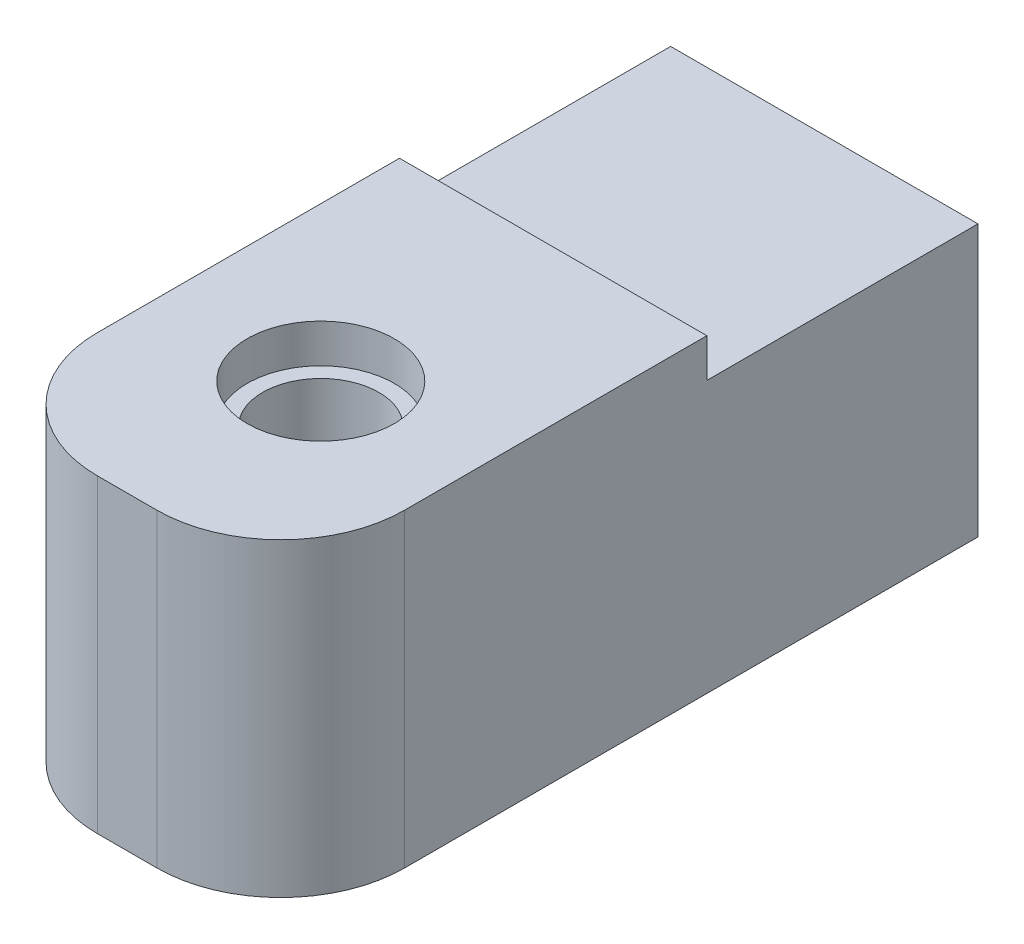
ISO-10303-21;
HEADER;
FILE_DESCRIPTION(('STEP AP214'),'2;1');
FILE_NAME('part.step','',(''),(''),'','','');
FILE_SCHEMA(('AUTOMOTIVE_DESIGN { 1 0 10303 214 1 1 1 1 }'));
ENDSEC;
DATA;
#1=APPLICATION_CONTEXT('core data for automotive mechanical design processes');
#2=APPLICATION_PROTOCOL_DEFINITION('international standard','automotive_design',2000,#1);
#3=PRODUCT_CONTEXT('',#1,'mechanical');
#4=PRODUCT('Part','Part','',(#3));
#5=PRODUCT_RELATED_PRODUCT_CATEGORY('part','',(#4));
#6=PRODUCT_DEFINITION_FORMATION('','',#4);
#7=PRODUCT_DEFINITION_CONTEXT('part definition',#1,'design');
#8=PRODUCT_DEFINITION('design','',#6,#7);
#9=PRODUCT_DEFINITION_SHAPE('','',#8);
#10=(LENGTH_UNIT() NAMED_UNIT(*) SI_UNIT(.MILLI.,.METRE.));
#11=(NAMED_UNIT(*) PLANE_ANGLE_UNIT() SI_UNIT($,.RADIAN.));
#12=(NAMED_UNIT(*) SI_UNIT($,.STERADIAN.) SOLID_ANGLE_UNIT());
#13=UNCERTAINTY_MEASURE_WITH_UNIT(LENGTH_MEASURE(1.E-05),#10,'distance_accuracy_value','');
#14=(GEOMETRIC_REPRESENTATION_CONTEXT(3) GLOBAL_UNCERTAINTY_ASSIGNED_CONTEXT((#13)) GLOBAL_UNIT_ASSIGNED_CONTEXT((#10,
#11,#12)) REPRESENTATION_CONTEXT('',''));
#15=CARTESIAN_POINT('',(0.,0.,0.));
#16=DIRECTION('',(0.,0.,1.));
#17=DIRECTION('',(1.,0.,0.));
#18=AXIS2_PLACEMENT_3D('',#15,#16,#17);
#19=CARTESIAN_POINT('',(-4.26803278688524,9.21270491803279,57.15));
#20=DIRECTION('',(-1.,0.,0.));
#21=DIRECTION('',(0.,0.,1.));
#22=AXIS2_PLACEMENT_3D('',#19,#20,#21);
#23=PLANE('',#22);
#24=DIRECTION('',(0.,0.,-1.));
#25=VECTOR('',#24,1.);
#26=CARTESIAN_POINT('',(-4.26803278688524,9.21270491803279,57.15));
#27=LINE('',#26,#25);
#28=CARTESIAN_POINT('',(-4.26803278688524,9.21270491803279,46.99));
#29=VERTEX_POINT('',#28);
#30=CARTESIAN_POINT('',(-4.26803278688524,9.21270491803279,22.225));
#31=VERTEX_POINT('',#30);
#32=EDGE_CURVE('E97',#29,#31,#27,.T.);
#33=ORIENTED_EDGE('',*,*,#32,.F.);
#34=DIRECTION('',(0.,1.,0.));
#35=VECTOR('',#34,1.);
#36=CARTESIAN_POINT('',(-4.26803278688524,-16.1872950819672,46.99));
#37=LINE('',#36,#35);
#38=CARTESIAN_POINT('',(-4.26803278688524,-16.1872950819672,46.99));
#39=VERTEX_POINT('',#38);
#40=EDGE_CURVE('E165',#29,#39,#37,.F.);
#41=ORIENTED_EDGE('',*,*,#40,.T.);
#42=DIRECTION('',(0.,0.,-1.));
#43=VECTOR('',#42,1.);
#44=CARTESIAN_POINT('',(-4.26803278688524,-16.1872950819672,57.15));
#45=LINE('',#44,#43);
#46=CARTESIAN_POINT('',(-4.26803278688524,-16.1872950819672,0.));
#47=VERTEX_POINT('',#46);
#48=EDGE_CURVE('E147',#39,#47,#45,.T.);
#49=ORIENTED_EDGE('',*,*,#48,.T.);
#50=DIRECTION('',(0.,1.,0.));
#51=VECTOR('',#50,1.);
#52=CARTESIAN_POINT('',(-4.26803278688524,9.21270491803279,0.));
#53=LINE('',#52,#51);
#54=CARTESIAN_POINT('',(-4.26803278688524,6.03770491803279,0.));
#55=VERTEX_POINT('',#54);
#56=EDGE_CURVE('E138',#47,#55,#53,.T.);
#57=ORIENTED_EDGE('',*,*,#56,.T.);
#58=DIRECTION('',(0.,0.,-1.));
#59=VECTOR('',#58,1.);
#60=CARTESIAN_POINT('',(-4.26803278688524,6.03770491803279,0.));
#61=LINE('',#60,#59);
#62=CARTESIAN_POINT('',(-4.26803278688524,6.03770491803279,22.225));
#63=VERTEX_POINT('',#62);
#64=EDGE_CURVE('E119',#63,#55,#61,.T.);
#65=ORIENTED_EDGE('',*,*,#64,.F.);
#66=DIRECTION('',(0.,-1.,0.));
#67=VECTOR('',#66,1.);
#68=CARTESIAN_POINT('',(-4.26803278688524,9.21270491803279,22.225));
#69=LINE('',#68,#67);
#70=EDGE_CURVE('E114',#31,#63,#69,.T.);
#71=ORIENTED_EDGE('',*,*,#70,.F.);
#72=EDGE_LOOP('',(#33,#41,#49,#57,#65,#71));
#73=FACE_BOUND('',#72,.T.);
#74=ADVANCED_FACE('F34',(#73),#23,.F.);
#75=CARTESIAN_POINT('',(-29.4598360655737,9.21270491803279,57.15));
#76=DIRECTION('',(0.,-1.,0.));
#77=DIRECTION('',(0.,0.,-1.));
#78=AXIS2_PLACEMENT_3D('',#75,#76,#77);
#79=PLANE('',#78);
#80=CARTESIAN_POINT('',(-16.8639344262295,9.21270491803279,41.275));
#81=DIRECTION('',(0.,1.,0.));
#82=DIRECTION('',(0.,0.,1.));
#83=AXIS2_PLACEMENT_3D('',#80,#81,#82);
#84=CIRCLE('',#83,6.0325);
#85=CARTESIAN_POINT('',(-16.8639344262295,9.21270491803279,47.3075));
#86=VERTEX_POINT('',#85);
#87=EDGE_CURVE('E126',#86,#86,#84,.T.);
#88=ORIENTED_EDGE('',*,*,#87,.F.);
#89=EDGE_LOOP('',(#88));
#90=FACE_BOUND('',#89,.T.);
#91=DIRECTION('',(0.,0.,-1.));
#92=VECTOR('',#91,1.);
#93=CARTESIAN_POINT('',(-29.4598360655737,9.21270491803279,57.15));
#94=LINE('',#93,#92);
#95=CARTESIAN_POINT('',(-29.4598360655737,9.21270491803279,46.99));
#96=VERTEX_POINT('',#95);
#97=CARTESIAN_POINT('',(-29.4598360655737,9.21270491803279,22.225));
#98=VERTEX_POINT('',#97);
#99=EDGE_CURVE('E107',#96,#98,#94,.T.);
#100=ORIENTED_EDGE('',*,*,#99,.F.);
#101=CARTESIAN_POINT('',(-19.2998360655737,9.21270491803279,46.99));
#102=DIRECTION('',(0.,-1.,0.));
#103=DIRECTION('',(0.,0.,-1.));
#104=AXIS2_PLACEMENT_3D('',#101,#102,#103);
#105=CIRCLE('',#104,10.16);
#106=CARTESIAN_POINT('',(-19.2998360655737,9.21270491803279,57.15));
#107=VERTEX_POINT('',#106);
#108=EDGE_CURVE('E11',#96,#107,#105,.F.);
#109=ORIENTED_EDGE('',*,*,#108,.T.);
#110=DIRECTION('',(-1.,0.,0.));
#111=VECTOR('',#110,1.);
#112=CARTESIAN_POINT('',(-29.4598360655737,9.21270491803279,57.15));
#113=LINE('',#112,#111);
#114=CARTESIAN_POINT('',(-14.4280327868852,9.21270491803279,57.15));
#115=VERTEX_POINT('',#114);
#116=EDGE_CURVE('E141',#115,#107,#113,.T.);
#117=ORIENTED_EDGE('',*,*,#116,.F.);
#118=CARTESIAN_POINT('',(-14.4280327868852,9.21270491803279,46.99));
#119=DIRECTION('',(0.,-1.,0.));
#120=DIRECTION('',(0.,0.,-1.));
#121=AXIS2_PLACEMENT_3D('',#118,#119,#120);
#122=CIRCLE('',#121,10.16);
#123=EDGE_CURVE('E102',#115,#29,#122,.F.);
#124=ORIENTED_EDGE('',*,*,#123,.T.);
#125=ORIENTED_EDGE('',*,*,#32,.T.);
#126=DIRECTION('',(1.,0.,0.));
#127=VECTOR('',#126,1.);
#128=CARTESIAN_POINT('',(-34.4432327868852,9.21270491803279,22.225));
#129=LINE('',#128,#127);
#130=EDGE_CURVE('E100',#98,#31,#129,.T.);
#131=ORIENTED_EDGE('',*,*,#130,.F.);
#132=EDGE_LOOP('',(#100,#109,#117,#124,#125,#131));
#133=FACE_BOUND('',#132,.T.);
#134=ADVANCED_FACE('F99',(#90,#133),#79,.F.);
#135=CARTESIAN_POINT('',(-29.4598360655737,9.21270491803279,57.15));
#136=DIRECTION('',(1.,0.,0.));
#137=DIRECTION('',(0.,0.,-1.));
#138=AXIS2_PLACEMENT_3D('',#135,#136,#137);
#139=PLANE('',#138);
#140=DIRECTION('',(0.,0.,-1.));
#141=VECTOR('',#140,1.);
#142=CARTESIAN_POINT('',(-29.4598360655737,-16.1872950819672,57.15));
#143=LINE('',#142,#141);
#144=CARTESIAN_POINT('',(-29.4598360655737,-16.1872950819672,46.99));
#145=VERTEX_POINT('',#144);
#146=CARTESIAN_POINT('',(-29.4598360655737,-16.1872950819672,0.));
#147=VERTEX_POINT('',#146);
#148=EDGE_CURVE('E155',#145,#147,#143,.T.);
#149=ORIENTED_EDGE('',*,*,#148,.F.);
#150=DIRECTION('',(0.,-1.,0.));
#151=VECTOR('',#150,1.);
#152=CARTESIAN_POINT('',(-29.4598360655737,9.21270491803279,46.99));
#153=LINE('',#152,#151);
#154=EDGE_CURVE('E42',#145,#96,#153,.F.);
#155=ORIENTED_EDGE('',*,*,#154,.T.);
#156=ORIENTED_EDGE('',*,*,#99,.T.);
#157=DIRECTION('',(0.,-1.,0.));
#158=VECTOR('',#157,1.);
#159=CARTESIAN_POINT('',(-29.4598360655737,9.21270491803279,22.225));
#160=LINE('',#159,#158);
#161=CARTESIAN_POINT('',(-29.4598360655737,6.03770491803279,22.225));
#162=VERTEX_POINT('',#161);
#163=EDGE_CURVE('E117',#98,#162,#160,.T.);
#164=ORIENTED_EDGE('',*,*,#163,.T.);
#165=DIRECTION('',(0.,0.,-1.));
#166=VECTOR('',#165,1.);
#167=CARTESIAN_POINT('',(-29.4598360655737,6.03770491803278,57.15));
#168=LINE('',#167,#166);
#169=CARTESIAN_POINT('',(-29.4598360655737,6.03770491803279,0.));
#170=VERTEX_POINT('',#169);
#171=EDGE_CURVE('E130',#162,#170,#168,.T.);
#172=ORIENTED_EDGE('',*,*,#171,.T.);
#173=DIRECTION('',(0.,-1.,0.));
#174=VECTOR('',#173,1.);
#175=CARTESIAN_POINT('',(-29.4598360655737,9.21270491803279,0.));
#176=LINE('',#175,#174);
#177=EDGE_CURVE('E149',#170,#147,#176,.T.);
#178=ORIENTED_EDGE('',*,*,#177,.T.);
#179=EDGE_LOOP('',(#149,#155,#156,#164,#172,#178));
#180=FACE_BOUND('',#179,.T.);
#181=ADVANCED_FACE('F194',(#180),#139,.F.);
#182=CARTESIAN_POINT('',(-29.4598360655737,-16.1872950819672,57.15));
#183=DIRECTION('',(0.,1.,0.));
#184=DIRECTION('',(0.,0.,1.));
#185=AXIS2_PLACEMENT_3D('',#182,#183,#184);
#186=PLANE('',#185);
#187=CARTESIAN_POINT('',(-16.8639344262295,-16.1872950819672,41.275));
#188=DIRECTION('',(0.,1.,0.));
#189=DIRECTION('',(0.,0.,1.));
#190=AXIS2_PLACEMENT_3D('',#187,#188,#189);
#191=CIRCLE('',#190,4.7625);
#192=CARTESIAN_POINT('',(-16.8639344262295,-16.1872950819672,46.0375));
#193=VERTEX_POINT('',#192);
#194=EDGE_CURVE('E238',#193,#193,#191,.T.);
#195=ORIENTED_EDGE('',*,*,#194,.T.);
#196=EDGE_LOOP('',(#195));
#197=FACE_BOUND('',#196,.T.);
#198=DIRECTION('',(1.,0.,0.));
#199=VECTOR('',#198,1.);
#200=CARTESIAN_POINT('',(-29.4598360655737,-16.1872950819672,57.15));
#201=LINE('',#200,#199);
#202=CARTESIAN_POINT('',(-19.2998360655737,-16.1872950819672,57.15));
#203=VERTEX_POINT('',#202);
#204=CARTESIAN_POINT('',(-14.4280327868852,-16.1872950819672,57.15));
#205=VERTEX_POINT('',#204);
#206=EDGE_CURVE('E144',#203,#205,#201,.T.);
#207=ORIENTED_EDGE('',*,*,#206,.F.);
#208=CARTESIAN_POINT('',(-19.2998360655737,-16.1872950819672,46.99));
#209=DIRECTION('',(0.,1.,0.));
#210=DIRECTION('',(0.,0.,1.));
#211=AXIS2_PLACEMENT_3D('',#208,#209,#210);
#212=CIRCLE('',#211,10.16);
#213=EDGE_CURVE('E56',#203,#145,#212,.F.);
#214=ORIENTED_EDGE('',*,*,#213,.T.);
#215=ORIENTED_EDGE('',*,*,#148,.T.);
#216=DIRECTION('',(1.,0.,0.));
#217=VECTOR('',#216,1.);
#218=CARTESIAN_POINT('',(-29.4598360655737,-16.1872950819672,0.));
#219=LINE('',#218,#217);
#220=EDGE_CURVE('E145',#147,#47,#219,.T.);
#221=ORIENTED_EDGE('',*,*,#220,.T.);
#222=ORIENTED_EDGE('',*,*,#48,.F.);
#223=CARTESIAN_POINT('',(-14.4280327868852,-16.1872950819672,46.99));
#224=DIRECTION('',(0.,1.,0.));
#225=DIRECTION('',(0.,0.,1.));
#226=AXIS2_PLACEMENT_3D('',#223,#224,#225);
#227=CIRCLE('',#226,10.16);
#228=EDGE_CURVE('E167',#39,#205,#227,.F.);
#229=ORIENTED_EDGE('',*,*,#228,.T.);
#230=EDGE_LOOP('',(#207,#214,#215,#221,#222,#229));
#231=FACE_BOUND('',#230,.T.);
#232=ADVANCED_FACE('F178',(#197,#231),#186,.F.);
#233=CARTESIAN_POINT('',(0.,0.,57.15));
#234=DIRECTION('',(0.,0.,1.));
#235=DIRECTION('',(1.,0.,0.));
#236=AXIS2_PLACEMENT_3D('',#233,#234,#235);
#237=PLANE('',#236);
#238=ORIENTED_EDGE('',*,*,#116,.T.);
#239=DIRECTION('',(0.,-1.,0.));
#240=VECTOR('',#239,1.);
#241=CARTESIAN_POINT('',(-19.2998360655737,-16.1872950819672,57.15));
#242=LINE('',#241,#240);
#243=EDGE_CURVE('E170',#107,#203,#242,.T.);
#244=ORIENTED_EDGE('',*,*,#243,.T.);
#245=ORIENTED_EDGE('',*,*,#206,.T.);
#246=DIRECTION('',(0.,1.,0.));
#247=VECTOR('',#246,1.);
#248=CARTESIAN_POINT('',(-14.4280327868852,9.21270491803279,57.15));
#249=LINE('',#248,#247);
#250=EDGE_CURVE('E161',#205,#115,#249,.T.);
#251=ORIENTED_EDGE('',*,*,#250,.T.);
#252=EDGE_LOOP('',(#238,#244,#245,#251));
#253=FACE_BOUND('',#252,.T.);
#254=ADVANCED_FACE('F175',(#253),#237,.T.);
#255=CARTESIAN_POINT('',(0.,0.,0.));
#256=DIRECTION('',(0.,0.,1.));
#257=DIRECTION('',(1.,0.,0.));
#258=AXIS2_PLACEMENT_3D('',#255,#256,#257);
#259=PLANE('',#258);
#260=CARTESIAN_POINT('',(-16.8988673100082,-3.45236219818828,0.));
#261=DIRECTION('',(0.,0.,-1.));
#262=DIRECTION('',(-1.,0.,0.));
#263=AXIS2_PLACEMENT_3D('',#260,#261,#262);
#264=CIRCLE('',#263,4.69665444805547);
#265=CARTESIAN_POINT('',(-21.5955217580637,-3.45236219818828,0.));
#266=VERTEX_POINT('',#265);
#267=EDGE_CURVE('E134',#266,#266,#264,.T.);
#268=ORIENTED_EDGE('',*,*,#267,.F.);
#269=EDGE_LOOP('',(#268));
#270=FACE_BOUND('',#269,.T.);
#271=ORIENTED_EDGE('',*,*,#177,.F.);
#272=DIRECTION('',(1.,0.,0.));
#273=VECTOR('',#272,1.);
#274=CARTESIAN_POINT('',(0.,6.03770491803279,0.));
#275=LINE('',#274,#273);
#276=EDGE_CURVE('E106',#170,#55,#275,.T.);
#277=ORIENTED_EDGE('',*,*,#276,.T.);
#278=ORIENTED_EDGE('',*,*,#56,.F.);
#279=ORIENTED_EDGE('',*,*,#220,.F.);
#280=EDGE_LOOP('',(#271,#277,#278,#279));
#281=FACE_BOUND('',#280,.T.);
#282=ADVANCED_FACE('F203',(#270,#281),#259,.F.);
#283=CARTESIAN_POINT('',(-16.8988673100082,-3.45236219818828,30.1752));
#284=DIRECTION('',(0.,0.,-1.));
#285=DIRECTION('',(-1.,0.,0.));
#286=AXIS2_PLACEMENT_3D('',#283,#284,#285);
#287=CYLINDRICAL_SURFACE('',#286,4.69665444805547);
#288=CARTESIAN_POINT('',(-16.8988673100082,-3.45236219818828,30.1752));
#289=DIRECTION('',(0.,0.,-1.));
#290=DIRECTION('',(-1.,0.,0.));
#291=AXIS2_PLACEMENT_3D('',#288,#289,#290);
#292=CIRCLE('',#291,4.69665444805547);
#293=CARTESIAN_POINT('',(-21.5955217580637,-3.45236219818828,30.1752));
#294=VERTEX_POINT('',#293);
#295=EDGE_CURVE('E135',#294,#294,#292,.T.);
#296=ORIENTED_EDGE('',*,*,#295,.F.);
#297=EDGE_LOOP('',(#296));
#298=FACE_BOUND('',#297,.T.);
#299=ORIENTED_EDGE('',*,*,#267,.T.);
#300=EDGE_LOOP('',(#299));
#301=FACE_BOUND('',#300,.T.);
#302=ADVANCED_FACE('F206',(#298,#301),#287,.F.);
#303=CARTESIAN_POINT('',(-16.8988673100082,-3.45236219818828,30.1752));
#304=DIRECTION('',(0.,0.,-1.));
#305=DIRECTION('',(-1.,0.,0.));
#306=AXIS2_PLACEMENT_3D('',#303,#304,#305);
#307=PLANE('',#306);
#308=ORIENTED_EDGE('',*,*,#295,.T.);
#309=EDGE_LOOP('',(#308));
#310=FACE_BOUND('',#309,.T.);
#311=ADVANCED_FACE('F212',(#310),#307,.T.);
#312=CARTESIAN_POINT('',(-34.4432327868852,9.21270491803279,22.225));
#313=DIRECTION('',(0.,0.,1.));
#314=DIRECTION('',(1.,0.,0.));
#315=AXIS2_PLACEMENT_3D('',#312,#313,#314);
#316=PLANE('',#315);
#317=ORIENTED_EDGE('',*,*,#130,.T.);
#318=ORIENTED_EDGE('',*,*,#70,.T.);
#319=DIRECTION('',(1.,0.,0.));
#320=VECTOR('',#319,1.);
#321=CARTESIAN_POINT('',(-34.4432327868852,6.03770491803279,22.225));
#322=LINE('',#321,#320);
#323=EDGE_CURVE('E118',#162,#63,#322,.T.);
#324=ORIENTED_EDGE('',*,*,#323,.F.);
#325=ORIENTED_EDGE('',*,*,#163,.F.);
#326=EDGE_LOOP('',(#317,#318,#324,#325));
#327=FACE_BOUND('',#326,.T.);
#328=ADVANCED_FACE('F112',(#327),#316,.F.);
#329=CARTESIAN_POINT('',(-34.4432327868852,6.03770491803279,0.));
#330=DIRECTION('',(0.,-1.,0.));
#331=DIRECTION('',(0.,0.,-1.));
#332=AXIS2_PLACEMENT_3D('',#329,#330,#331);
#333=PLANE('',#332);
#334=ORIENTED_EDGE('',*,*,#323,.T.);
#335=ORIENTED_EDGE('',*,*,#64,.T.);
#336=ORIENTED_EDGE('',*,*,#276,.F.);
#337=ORIENTED_EDGE('',*,*,#171,.F.);
#338=EDGE_LOOP('',(#334,#335,#336,#337));
#339=FACE_BOUND('',#338,.T.);
#340=ADVANCED_FACE('F219',(#339),#333,.F.);
#341=CARTESIAN_POINT('',(-16.8639344262295,6.03770491803279,41.275));
#342=DIRECTION('',(0.,1.,0.));
#343=DIRECTION('',(0.,0.,1.));
#344=AXIS2_PLACEMENT_3D('',#341,#342,#343);
#345=CYLINDRICAL_SURFACE('',#344,6.0325);
#346=CARTESIAN_POINT('',(-16.8639344262295,6.03770491803279,41.275));
#347=DIRECTION('',(0.,1.,0.));
#348=DIRECTION('',(0.,0.,1.));
#349=AXIS2_PLACEMENT_3D('',#346,#347,#348);
#350=CIRCLE('',#349,6.0325);
#351=CARTESIAN_POINT('',(-16.8639344262295,6.03770491803279,47.3075));
#352=VERTEX_POINT('',#351);
#353=EDGE_CURVE('E122',#352,#352,#350,.T.);
#354=ORIENTED_EDGE('',*,*,#353,.F.);
#355=EDGE_LOOP('',(#354));
#356=FACE_BOUND('',#355,.T.);
#357=ORIENTED_EDGE('',*,*,#87,.T.);
#358=EDGE_LOOP('',(#357));
#359=FACE_BOUND('',#358,.T.);
#360=ADVANCED_FACE('F222',(#356,#359),#345,.F.);
#361=CARTESIAN_POINT('',(-16.8639344262295,6.03770491803279,41.275));
#362=DIRECTION('',(0.,1.,0.));
#363=DIRECTION('',(0.,0.,1.));
#364=AXIS2_PLACEMENT_3D('',#361,#362,#363);
#365=PLANE('',#364);
#366=CARTESIAN_POINT('',(-16.8639344262295,6.03770491803279,41.275));
#367=DIRECTION('',(0.,1.,0.));
#368=DIRECTION('',(0.,0.,1.));
#369=AXIS2_PLACEMENT_3D('',#366,#367,#368);
#370=CIRCLE('',#369,4.7625);
#371=CARTESIAN_POINT('',(-16.8639344262295,6.03770491803279,46.0375));
#372=VERTEX_POINT('',#371);
#373=EDGE_CURVE('E241',#372,#372,#370,.T.);
#374=ORIENTED_EDGE('',*,*,#373,.F.);
#375=EDGE_LOOP('',(#374));
#376=FACE_BOUND('',#375,.T.);
#377=ORIENTED_EDGE('',*,*,#353,.T.);
#378=EDGE_LOOP('',(#377));
#379=FACE_BOUND('',#378,.T.);
#380=ADVANCED_FACE('F226',(#376,#379),#365,.T.);
#381=CARTESIAN_POINT('',(-16.8639344262295,-16.1872950819672,41.275));
#382=DIRECTION('',(0.,1.,0.));
#383=DIRECTION('',(0.,0.,1.));
#384=AXIS2_PLACEMENT_3D('',#381,#382,#383);
#385=CYLINDRICAL_SURFACE('',#384,4.7625);
#386=ORIENTED_EDGE('',*,*,#194,.F.);
#387=EDGE_LOOP('',(#386));
#388=FACE_BOUND('',#387,.T.);
#389=ORIENTED_EDGE('',*,*,#373,.T.);
#390=EDGE_LOOP('',(#389));
#391=FACE_BOUND('',#390,.T.);
#392=ADVANCED_FACE('F188',(#388,#391),#385,.F.);
#393=CARTESIAN_POINT('',(-14.4280327868852,0.,46.99));
#394=DIRECTION('',(0.,-1.,0.));
#395=DIRECTION('',(0.,0.,-1.));
#396=AXIS2_PLACEMENT_3D('',#393,#394,#395);
#397=CYLINDRICAL_SURFACE('',#396,10.16);
#398=ORIENTED_EDGE('',*,*,#228,.F.);
#399=ORIENTED_EDGE('',*,*,#40,.F.);
#400=ORIENTED_EDGE('',*,*,#123,.F.);
#401=ORIENTED_EDGE('',*,*,#250,.F.);
#402=EDGE_LOOP('',(#398,#399,#400,#401));
#403=FACE_BOUND('',#402,.T.);
#404=ADVANCED_FACE('F183',(#403),#397,.T.);
#405=CARTESIAN_POINT('',(-19.2998360655737,0.,46.99));
#406=DIRECTION('',(0.,1.,0.));
#407=DIRECTION('',(0.,0.,1.));
#408=AXIS2_PLACEMENT_3D('',#405,#406,#407);
#409=CYLINDRICAL_SURFACE('',#408,10.16);
#410=ORIENTED_EDGE('',*,*,#108,.F.);
#411=ORIENTED_EDGE('',*,*,#154,.F.);
#412=ORIENTED_EDGE('',*,*,#213,.F.);
#413=ORIENTED_EDGE('',*,*,#243,.F.);
#414=EDGE_LOOP('',(#410,#411,#412,#413));
#415=FACE_BOUND('',#414,.T.);
#416=ADVANCED_FACE('F36',(#415),#409,.T.);
#417=CLOSED_SHELL('',(#74,#134,#181,#232,#254,#282,#302,#311,#328,#340,#360,#380,#392,#404,#416));
#418=MANIFOLD_SOLID_BREP('B2',#417);
#419=ADVANCED_BREP_SHAPE_REPRESENTATION('',(#18,#418),#14);
#420=SHAPE_DEFINITION_REPRESENTATION(#9,#419);
ENDSEC;
END-ISO-10303-21;
